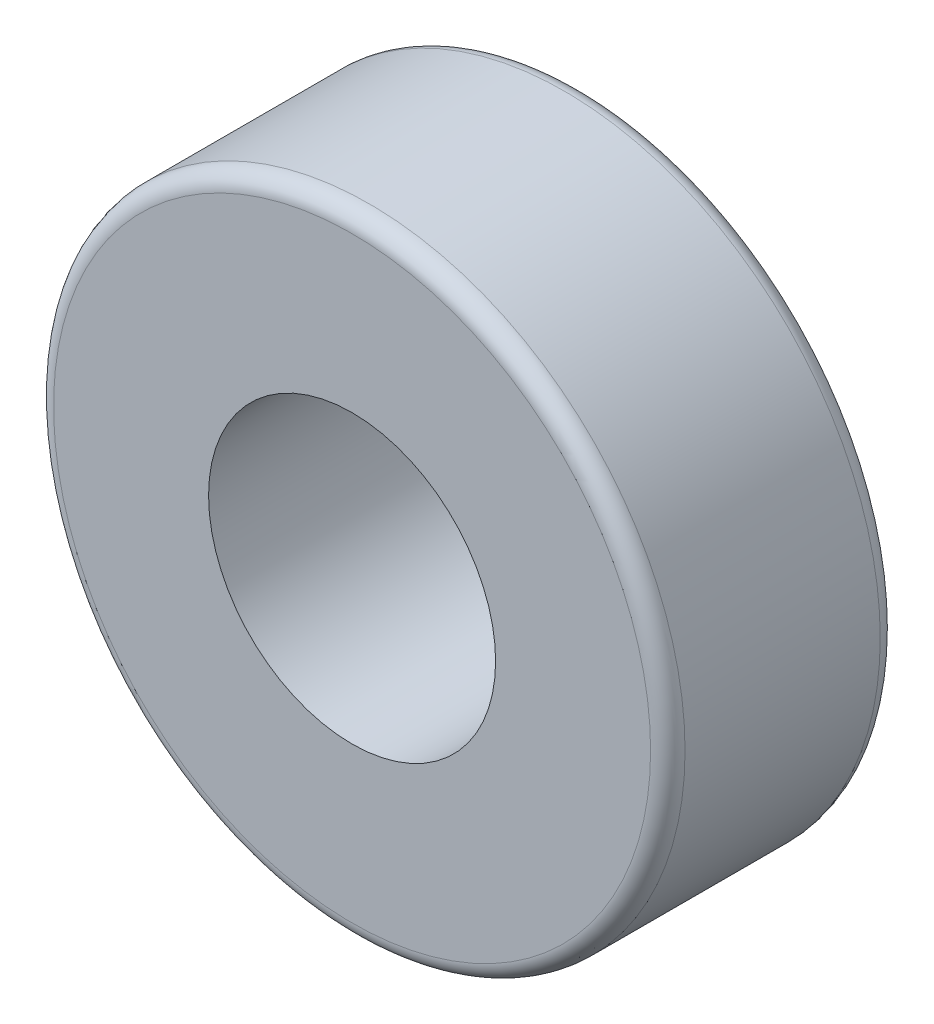
ISO-10303-21;
HEADER;
FILE_DESCRIPTION(('STEP AP214'),'2;1');
FILE_NAME('part.step','',(''),(''),'','','');
FILE_SCHEMA(('AUTOMOTIVE_DESIGN { 1 0 10303 214 1 1 1 1 }'));
ENDSEC;
DATA;
#1=APPLICATION_CONTEXT('core data for automotive mechanical design processes');
#2=APPLICATION_PROTOCOL_DEFINITION('international standard','automotive_design',2000,#1);
#3=PRODUCT_CONTEXT('',#1,'mechanical');
#4=PRODUCT('Part','Part','',(#3));
#5=PRODUCT_RELATED_PRODUCT_CATEGORY('part','',(#4));
#6=PRODUCT_DEFINITION_FORMATION('','',#4);
#7=PRODUCT_DEFINITION_CONTEXT('part definition',#1,'design');
#8=PRODUCT_DEFINITION('design','',#6,#7);
#9=PRODUCT_DEFINITION_SHAPE('','',#8);
#10=(LENGTH_UNIT() NAMED_UNIT(*) SI_UNIT(.MILLI.,.METRE.));
#11=(NAMED_UNIT(*) PLANE_ANGLE_UNIT() SI_UNIT($,.RADIAN.));
#12=(NAMED_UNIT(*) SI_UNIT($,.STERADIAN.) SOLID_ANGLE_UNIT());
#13=UNCERTAINTY_MEASURE_WITH_UNIT(LENGTH_MEASURE(1.E-05),#10,'distance_accuracy_value','');
#14=(GEOMETRIC_REPRESENTATION_CONTEXT(3) GLOBAL_UNCERTAINTY_ASSIGNED_CONTEXT((#13)) GLOBAL_UNIT_ASSIGNED_CONTEXT((#10,
#11,#12)) REPRESENTATION_CONTEXT('',''));
#15=CARTESIAN_POINT('',(0.,0.,0.));
#16=DIRECTION('',(0.,0.,1.));
#17=DIRECTION('',(1.,0.,0.));
#18=AXIS2_PLACEMENT_3D('',#15,#16,#17);
#19=CARTESIAN_POINT('',(0.,0.,2.));
#20=DIRECTION('',(0.,0.,1.));
#21=DIRECTION('',(1.,0.,0.));
#22=AXIS2_PLACEMENT_3D('',#19,#20,#21);
#23=PLANE('',#22);
#24=CARTESIAN_POINT('',(0.,0.,2.));
#25=DIRECTION('',(0.,0.,1.));
#26=DIRECTION('',(1.,0.,0.));
#27=AXIS2_PLACEMENT_3D('',#24,#25,#26);
#28=CIRCLE('',#27,5.2);
#29=CARTESIAN_POINT('',(5.2,0.,2.));
#30=VERTEX_POINT('',#29);
#31=EDGE_CURVE('E50',#30,#30,#28,.T.);
#32=ORIENTED_EDGE('',*,*,#31,.T.);
#33=EDGE_LOOP('',(#32));
#34=FACE_BOUND('',#33,.T.);
#35=CARTESIAN_POINT('',(0.,0.,2.));
#36=DIRECTION('',(0.,0.,1.));
#37=DIRECTION('',(1.,0.,0.));
#38=AXIS2_PLACEMENT_3D('',#35,#36,#37);
#39=CIRCLE('',#38,2.5);
#40=CARTESIAN_POINT('',(2.5,0.,2.));
#41=VERTEX_POINT('',#40);
#42=EDGE_CURVE('E69',#41,#41,#39,.T.);
#43=ORIENTED_EDGE('',*,*,#42,.F.);
#44=EDGE_LOOP('',(#43));
#45=FACE_BOUND('',#44,.T.);
#46=ADVANCED_FACE('F37',(#34,#45),#23,.T.);
#47=CARTESIAN_POINT('',(0.,0.,-2.));
#48=DIRECTION('',(0.,0.,1.));
#49=DIRECTION('',(1.,0.,0.));
#50=AXIS2_PLACEMENT_3D('',#47,#48,#49);
#51=PLANE('',#50);
#52=CARTESIAN_POINT('',(0.,0.,-2.));
#53=DIRECTION('',(0.,0.,1.));
#54=DIRECTION('',(1.,0.,0.));
#55=AXIS2_PLACEMENT_3D('',#52,#53,#54);
#56=CIRCLE('',#55,2.8);
#57=CARTESIAN_POINT('',(2.8,0.,-2.));
#58=VERTEX_POINT('',#57);
#59=EDGE_CURVE('E61',#58,#58,#56,.T.);
#60=ORIENTED_EDGE('',*,*,#59,.T.);
#61=EDGE_LOOP('',(#60));
#62=FACE_BOUND('',#61,.T.);
#63=CARTESIAN_POINT('',(0.,0.,-2.));
#64=DIRECTION('',(0.,0.,1.));
#65=DIRECTION('',(1.,0.,0.));
#66=AXIS2_PLACEMENT_3D('',#63,#64,#65);
#67=CIRCLE('',#66,5.2);
#68=CARTESIAN_POINT('',(5.2,0.,-2.));
#69=VERTEX_POINT('',#68);
#70=EDGE_CURVE('E65',#69,#69,#67,.F.);
#71=ORIENTED_EDGE('',*,*,#70,.T.);
#72=EDGE_LOOP('',(#71));
#73=FACE_BOUND('',#72,.T.);
#74=ADVANCED_FACE('F77',(#62,#73),#51,.F.);
#75=CARTESIAN_POINT('',(0.,0.,2.));
#76=DIRECTION('',(0.,0.,-1.));
#77=DIRECTION('',(-1.,0.,0.));
#78=AXIS2_PLACEMENT_3D('',#75,#76,#77);
#79=CYLINDRICAL_SURFACE('',#78,5.5);
#80=CARTESIAN_POINT('',(0.,0.,1.7));
#81=DIRECTION('',(0.,0.,1.));
#82=DIRECTION('',(1.,0.,0.));
#83=AXIS2_PLACEMENT_3D('',#80,#81,#82);
#84=CIRCLE('',#83,5.5);
#85=CARTESIAN_POINT('',(5.5,0.,1.7));
#86=VERTEX_POINT('',#85);
#87=EDGE_CURVE('E10',#86,#86,#84,.F.);
#88=ORIENTED_EDGE('',*,*,#87,.T.);
#89=EDGE_LOOP('',(#88));
#90=FACE_BOUND('',#89,.T.);
#91=CARTESIAN_POINT('',(0.,0.,-1.7));
#92=DIRECTION('',(0.,0.,1.));
#93=DIRECTION('',(1.,0.,0.));
#94=AXIS2_PLACEMENT_3D('',#91,#92,#93);
#95=CIRCLE('',#94,5.5);
#96=CARTESIAN_POINT('',(5.5,0.,-1.7));
#97=VERTEX_POINT('',#96);
#98=EDGE_CURVE('E45',#97,#97,#95,.T.);
#99=ORIENTED_EDGE('',*,*,#98,.T.);
#100=EDGE_LOOP('',(#99));
#101=FACE_BOUND('',#100,.T.);
#102=ADVANCED_FACE('F83',(#90,#101),#79,.T.);
#103=CARTESIAN_POINT('',(0.,0.,2.));
#104=DIRECTION('',(0.,0.,-1.));
#105=DIRECTION('',(-1.,0.,0.));
#106=AXIS2_PLACEMENT_3D('',#103,#104,#105);
#107=CYLINDRICAL_SURFACE('',#106,2.5);
#108=CARTESIAN_POINT('',(0.,0.,-1.7));
#109=DIRECTION('',(0.,0.,1.));
#110=DIRECTION('',(1.,0.,0.));
#111=AXIS2_PLACEMENT_3D('',#108,#109,#110);
#112=CIRCLE('',#111,2.5);
#113=CARTESIAN_POINT('',(2.5,0.,-1.7));
#114=VERTEX_POINT('',#113);
#115=EDGE_CURVE('E55',#114,#114,#112,.F.);
#116=ORIENTED_EDGE('',*,*,#115,.T.);
#117=EDGE_LOOP('',(#116));
#118=FACE_BOUND('',#117,.T.);
#119=ORIENTED_EDGE('',*,*,#42,.T.);
#120=EDGE_LOOP('',(#119));
#121=FACE_BOUND('',#120,.T.);
#122=ADVANCED_FACE('F74',(#118,#121),#107,.F.);
#123=CARTESIAN_POINT('',(0.,0.,-1.7));
#124=DIRECTION('',(0.,0.,1.));
#125=DIRECTION('',(1.,0.,0.));
#126=AXIS2_PLACEMENT_3D('',#123,#124,#125);
#127=TOROIDAL_SURFACE('',#126,2.8,0.3);
#128=ORIENTED_EDGE('',*,*,#115,.F.);
#129=EDGE_LOOP('',(#128));
#130=FACE_BOUND('',#129,.T.);
#131=ORIENTED_EDGE('',*,*,#59,.F.);
#132=EDGE_LOOP('',(#131));
#133=FACE_BOUND('',#132,.T.);
#134=ADVANCED_FACE('F90',(#130,#133),#127,.T.);
#135=CARTESIAN_POINT('',(0.,0.,1.7));
#136=DIRECTION('',(0.,0.,1.));
#137=DIRECTION('',(1.,0.,0.));
#138=AXIS2_PLACEMENT_3D('',#135,#136,#137);
#139=TOROIDAL_SURFACE('',#138,5.2,0.3);
#140=ORIENTED_EDGE('',*,*,#87,.F.);
#141=EDGE_LOOP('',(#140));
#142=FACE_BOUND('',#141,.T.);
#143=ORIENTED_EDGE('',*,*,#31,.F.);
#144=EDGE_LOOP('',(#143));
#145=FACE_BOUND('',#144,.T.);
#146=ADVANCED_FACE('F92',(#142,#145),#139,.T.);
#147=CARTESIAN_POINT('',(0.,0.,-1.7));
#148=DIRECTION('',(0.,0.,1.));
#149=DIRECTION('',(1.,0.,0.));
#150=AXIS2_PLACEMENT_3D('',#147,#148,#149);
#151=TOROIDAL_SURFACE('',#150,5.2,0.3);
#152=ORIENTED_EDGE('',*,*,#70,.F.);
#153=EDGE_LOOP('',(#152));
#154=FACE_BOUND('',#153,.T.);
#155=ORIENTED_EDGE('',*,*,#98,.F.);
#156=EDGE_LOOP('',(#155));
#157=FACE_BOUND('',#156,.T.);
#158=ADVANCED_FACE('F39',(#154,#157),#151,.T.);
#159=CLOSED_SHELL('',(#46,#74,#102,#122,#134,#146,#158));
#160=MANIFOLD_SOLID_BREP('B2',#159);
#161=ADVANCED_BREP_SHAPE_REPRESENTATION('',(#18,#160),#14);
#162=SHAPE_DEFINITION_REPRESENTATION(#9,#161);
ENDSEC;
END-ISO-10303-21;
